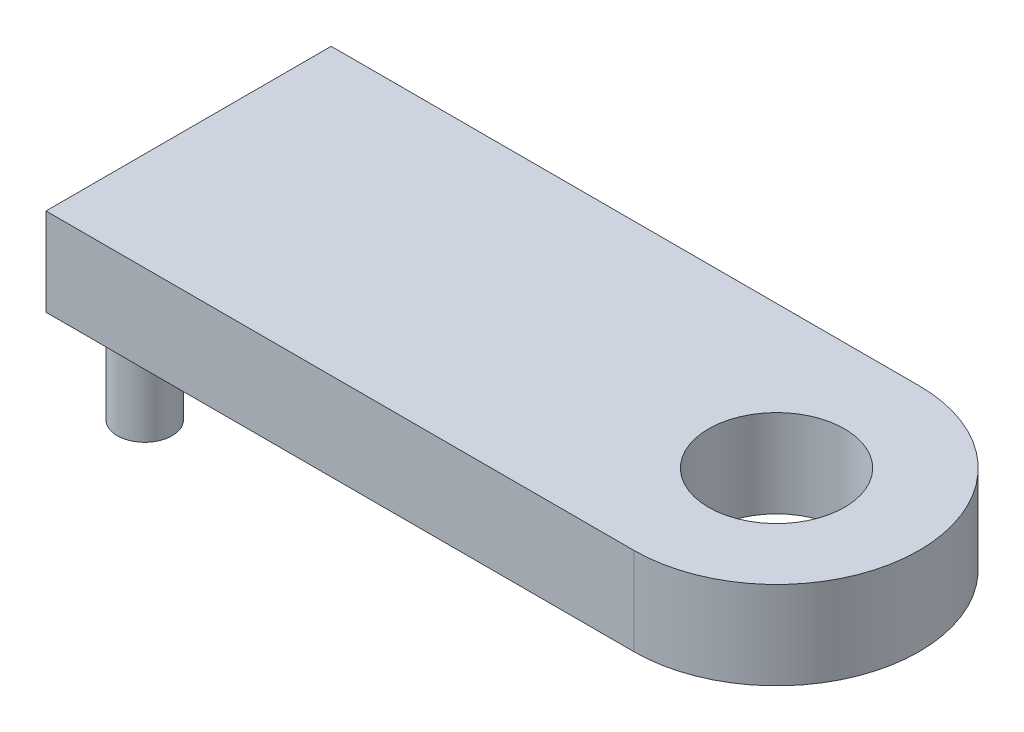
ISO-10303-21;
HEADER;
FILE_DESCRIPTION(('STEP AP214'),'2;1');
FILE_NAME('part.step','',(''),(''),'','','');
FILE_SCHEMA(('AUTOMOTIVE_DESIGN { 1 0 10303 214 1 1 1 1 }'));
ENDSEC;
DATA;
#1=APPLICATION_CONTEXT('core data for automotive mechanical design processes');
#2=APPLICATION_PROTOCOL_DEFINITION('international standard','automotive_design',2000,#1);
#3=PRODUCT_CONTEXT('',#1,'mechanical');
#4=PRODUCT('Part','Part','',(#3));
#5=PRODUCT_RELATED_PRODUCT_CATEGORY('part','',(#4));
#6=PRODUCT_DEFINITION_FORMATION('','',#4);
#7=PRODUCT_DEFINITION_CONTEXT('part definition',#1,'design');
#8=PRODUCT_DEFINITION('design','',#6,#7);
#9=PRODUCT_DEFINITION_SHAPE('','',#8);
#10=(LENGTH_UNIT() NAMED_UNIT(*) SI_UNIT(.MILLI.,.METRE.));
#11=(NAMED_UNIT(*) PLANE_ANGLE_UNIT() SI_UNIT($,.RADIAN.));
#12=(NAMED_UNIT(*) SI_UNIT($,.STERADIAN.) SOLID_ANGLE_UNIT());
#13=UNCERTAINTY_MEASURE_WITH_UNIT(LENGTH_MEASURE(1.E-05),#10,'distance_accuracy_value','');
#14=(GEOMETRIC_REPRESENTATION_CONTEXT(3) GLOBAL_UNCERTAINTY_ASSIGNED_CONTEXT((#13)) GLOBAL_UNIT_ASSIGNED_CONTEXT((#10,
#11,#12)) REPRESENTATION_CONTEXT('',''));
#15=CARTESIAN_POINT('',(0.,0.,0.));
#16=DIRECTION('',(0.,0.,1.));
#17=DIRECTION('',(1.,0.,0.));
#18=AXIS2_PLACEMENT_3D('',#15,#16,#17);
#19=CARTESIAN_POINT('',(5.5,27.1,0.));
#20=DIRECTION('',(0.,-1.,0.));
#21=DIRECTION('',(0.,0.,-1.));
#22=AXIS2_PLACEMENT_3D('',#19,#20,#21);
#23=CYLINDRICAL_SURFACE('',#22,6.5);
#24=CARTESIAN_POINT('',(5.5,23.1,0.));
#25=DIRECTION('',(0.,1.,0.));
#26=DIRECTION('',(0.,0.,1.));
#27=AXIS2_PLACEMENT_3D('',#24,#25,#26);
#28=CIRCLE('',#27,6.5);
#29=CARTESIAN_POINT('',(5.5,23.1,6.5));
#30=VERTEX_POINT('',#29);
#31=CARTESIAN_POINT('',(5.5,23.1,-6.5));
#32=VERTEX_POINT('',#31);
#33=EDGE_CURVE('E104',#30,#32,#28,.T.);
#34=ORIENTED_EDGE('',*,*,#33,.T.);
#35=DIRECTION('',(0.,-1.,0.));
#36=VECTOR('',#35,1.);
#37=CARTESIAN_POINT('',(5.5,27.1,-6.5));
#38=LINE('',#37,#36);
#39=CARTESIAN_POINT('',(5.5,27.1,-6.5));
#40=VERTEX_POINT('',#39);
#41=EDGE_CURVE('E95',#40,#32,#38,.T.);
#42=ORIENTED_EDGE('',*,*,#41,.F.);
#43=CARTESIAN_POINT('',(5.5,27.1,0.));
#44=DIRECTION('',(0.,1.,0.));
#45=DIRECTION('',(0.,0.,1.));
#46=AXIS2_PLACEMENT_3D('',#43,#44,#45);
#47=CIRCLE('',#46,6.5);
#48=CARTESIAN_POINT('',(5.5,27.1,6.5));
#49=VERTEX_POINT('',#48);
#50=EDGE_CURVE('E89',#49,#40,#47,.T.);
#51=ORIENTED_EDGE('',*,*,#50,.F.);
#52=DIRECTION('',(0.,-1.,0.));
#53=VECTOR('',#52,1.);
#54=CARTESIAN_POINT('',(5.5,27.1,6.5));
#55=LINE('',#54,#53);
#56=EDGE_CURVE('E100',#49,#30,#55,.T.);
#57=ORIENTED_EDGE('',*,*,#56,.T.);
#58=EDGE_LOOP('',(#34,#42,#51,#57));
#59=FACE_BOUND('',#58,.T.);
#60=ADVANCED_FACE('F37',(#59),#23,.T.);
#61=CARTESIAN_POINT('',(5.5,27.1,-6.5));
#62=DIRECTION('',(0.,0.,1.));
#63=DIRECTION('',(1.,0.,0.));
#64=AXIS2_PLACEMENT_3D('',#61,#62,#63);
#65=PLANE('',#64);
#66=DIRECTION('',(-1.,0.,0.));
#67=VECTOR('',#66,1.);
#68=CARTESIAN_POINT('',(5.5,23.1,-6.5));
#69=LINE('',#68,#67);
#70=CARTESIAN_POINT('',(-21.3,23.1,-6.5));
#71=VERTEX_POINT('',#70);
#72=EDGE_CURVE('E94',#32,#71,#69,.T.);
#73=ORIENTED_EDGE('',*,*,#72,.T.);
#74=DIRECTION('',(0.,-1.,0.));
#75=VECTOR('',#74,1.);
#76=CARTESIAN_POINT('',(-21.3,27.1,-6.5));
#77=LINE('',#76,#75);
#78=CARTESIAN_POINT('',(-21.3,27.1,-6.5));
#79=VERTEX_POINT('',#78);
#80=EDGE_CURVE('E92',#79,#71,#77,.T.);
#81=ORIENTED_EDGE('',*,*,#80,.F.);
#82=DIRECTION('',(-1.,0.,0.));
#83=VECTOR('',#82,1.);
#84=CARTESIAN_POINT('',(5.5,27.1,-6.5));
#85=LINE('',#84,#83);
#86=EDGE_CURVE('E84',#40,#79,#85,.T.);
#87=ORIENTED_EDGE('',*,*,#86,.F.);
#88=ORIENTED_EDGE('',*,*,#41,.T.);
#89=EDGE_LOOP('',(#73,#81,#87,#88));
#90=FACE_BOUND('',#89,.T.);
#91=ADVANCED_FACE('F93',(#90),#65,.F.);
#92=CARTESIAN_POINT('',(-21.3,27.1,-6.5));
#93=DIRECTION('',(1.,0.,0.));
#94=DIRECTION('',(0.,0.,-1.));
#95=AXIS2_PLACEMENT_3D('',#92,#93,#94);
#96=PLANE('',#95);
#97=DIRECTION('',(0.,0.,1.));
#98=VECTOR('',#97,1.);
#99=CARTESIAN_POINT('',(-21.3,23.1,-6.5));
#100=LINE('',#99,#98);
#101=CARTESIAN_POINT('',(-21.3,23.1,6.5));
#102=VERTEX_POINT('',#101);
#103=EDGE_CURVE('E70',#71,#102,#100,.T.);
#104=ORIENTED_EDGE('',*,*,#103,.T.);
#105=DIRECTION('',(0.,-1.,0.));
#106=VECTOR('',#105,1.);
#107=CARTESIAN_POINT('',(-21.3,27.1,6.5));
#108=LINE('',#107,#106);
#109=CARTESIAN_POINT('',(-21.3,27.1,6.5));
#110=VERTEX_POINT('',#109);
#111=EDGE_CURVE('E96',#110,#102,#108,.T.);
#112=ORIENTED_EDGE('',*,*,#111,.F.);
#113=DIRECTION('',(0.,0.,1.));
#114=VECTOR('',#113,1.);
#115=CARTESIAN_POINT('',(-21.3,27.1,-6.5));
#116=LINE('',#115,#114);
#117=EDGE_CURVE('E87',#79,#110,#116,.T.);
#118=ORIENTED_EDGE('',*,*,#117,.F.);
#119=ORIENTED_EDGE('',*,*,#80,.T.);
#120=EDGE_LOOP('',(#104,#112,#118,#119));
#121=FACE_BOUND('',#120,.T.);
#122=ADVANCED_FACE('F98',(#121),#96,.F.);
#123=CARTESIAN_POINT('',(-21.3,27.1,6.5));
#124=DIRECTION('',(0.,0.,-1.));
#125=DIRECTION('',(-1.,0.,0.));
#126=AXIS2_PLACEMENT_3D('',#123,#124,#125);
#127=PLANE('',#126);
#128=DIRECTION('',(1.,0.,0.));
#129=VECTOR('',#128,1.);
#130=CARTESIAN_POINT('',(-21.3,23.1,6.5));
#131=LINE('',#130,#129);
#132=EDGE_CURVE('E76',#102,#30,#131,.T.);
#133=ORIENTED_EDGE('',*,*,#132,.T.);
#134=ORIENTED_EDGE('',*,*,#56,.F.);
#135=DIRECTION('',(1.,0.,0.));
#136=VECTOR('',#135,1.);
#137=CARTESIAN_POINT('',(-21.3,27.1,6.5));
#138=LINE('',#137,#136);
#139=EDGE_CURVE('E53',#110,#49,#138,.T.);
#140=ORIENTED_EDGE('',*,*,#139,.F.);
#141=ORIENTED_EDGE('',*,*,#111,.T.);
#142=EDGE_LOOP('',(#133,#134,#140,#141));
#143=FACE_BOUND('',#142,.T.);
#144=ADVANCED_FACE('F131',(#143),#127,.F.);
#145=CARTESIAN_POINT('',(5.5,27.1,0.));
#146=DIRECTION('',(0.,1.,0.));
#147=DIRECTION('',(0.,0.,1.));
#148=AXIS2_PLACEMENT_3D('',#145,#146,#147);
#149=PLANE('',#148);
#150=CARTESIAN_POINT('',(5.5,27.1,0.));
#151=DIRECTION('',(0.,1.,0.));
#152=DIRECTION('',(0.,0.,1.));
#153=AXIS2_PLACEMENT_3D('',#150,#151,#152);
#154=CIRCLE('',#153,3.1);
#155=CARTESIAN_POINT('',(5.5,27.1,3.1));
#156=VERTEX_POINT('',#155);
#157=EDGE_CURVE('E107',#156,#156,#154,.T.);
#158=ORIENTED_EDGE('',*,*,#157,.F.);
#159=EDGE_LOOP('',(#158));
#160=FACE_BOUND('',#159,.T.);
#161=ORIENTED_EDGE('',*,*,#50,.T.);
#162=ORIENTED_EDGE('',*,*,#86,.T.);
#163=ORIENTED_EDGE('',*,*,#117,.T.);
#164=ORIENTED_EDGE('',*,*,#139,.T.);
#165=EDGE_LOOP('',(#161,#162,#163,#164));
#166=FACE_BOUND('',#165,.T.);
#167=ADVANCED_FACE('F85',(#160,#166),#149,.T.);
#168=CARTESIAN_POINT('',(5.5,23.1,0.));
#169=DIRECTION('',(0.,1.,0.));
#170=DIRECTION('',(0.,0.,1.));
#171=AXIS2_PLACEMENT_3D('',#168,#169,#170);
#172=PLANE('',#171);
#173=CARTESIAN_POINT('',(-18.8,23.1,-4.5));
#174=DIRECTION('',(0.,1.,0.));
#175=DIRECTION('',(0.,0.,1.));
#176=AXIS2_PLACEMENT_3D('',#173,#174,#175);
#177=CIRCLE('',#176,1.25);
#178=CARTESIAN_POINT('',(-18.8,23.1,-3.25));
#179=VERTEX_POINT('',#178);
#180=EDGE_CURVE('E11',#179,#179,#177,.F.);
#181=ORIENTED_EDGE('',*,*,#180,.F.);
#182=EDGE_LOOP('',(#181));
#183=FACE_BOUND('',#182,.T.);
#184=CARTESIAN_POINT('',(-18.8,23.1,4.5));
#185=DIRECTION('',(0.,1.,0.));
#186=DIRECTION('',(0.,0.,1.));
#187=AXIS2_PLACEMENT_3D('',#184,#185,#186);
#188=CIRCLE('',#187,1.25);
#189=CARTESIAN_POINT('',(-18.8,23.1,5.75));
#190=VERTEX_POINT('',#189);
#191=EDGE_CURVE('E45',#190,#190,#188,.F.);
#192=ORIENTED_EDGE('',*,*,#191,.F.);
#193=EDGE_LOOP('',(#192));
#194=FACE_BOUND('',#193,.T.);
#195=CARTESIAN_POINT('',(5.5,23.1,0.));
#196=DIRECTION('',(0.,1.,0.));
#197=DIRECTION('',(0.,0.,1.));
#198=AXIS2_PLACEMENT_3D('',#195,#196,#197);
#199=CIRCLE('',#198,3.1);
#200=CARTESIAN_POINT('',(5.5,23.1,3.1));
#201=VERTEX_POINT('',#200);
#202=EDGE_CURVE('E128',#201,#201,#199,.T.);
#203=ORIENTED_EDGE('',*,*,#202,.T.);
#204=EDGE_LOOP('',(#203));
#205=FACE_BOUND('',#204,.T.);
#206=ORIENTED_EDGE('',*,*,#33,.F.);
#207=ORIENTED_EDGE('',*,*,#132,.F.);
#208=ORIENTED_EDGE('',*,*,#103,.F.);
#209=ORIENTED_EDGE('',*,*,#72,.F.);
#210=EDGE_LOOP('',(#206,#207,#208,#209));
#211=FACE_BOUND('',#210,.T.);
#212=ADVANCED_FACE('F119',(#183,#194,#205,#211),#172,.F.);
#213=CARTESIAN_POINT('',(5.5,27.1,0.));
#214=DIRECTION('',(0.,-1.,0.));
#215=DIRECTION('',(0.,0.,-1.));
#216=AXIS2_PLACEMENT_3D('',#213,#214,#215);
#217=CYLINDRICAL_SURFACE('',#216,3.1);
#218=ORIENTED_EDGE('',*,*,#157,.T.);
#219=EDGE_LOOP('',(#218));
#220=FACE_BOUND('',#219,.T.);
#221=ORIENTED_EDGE('',*,*,#202,.F.);
#222=EDGE_LOOP('',(#221));
#223=FACE_BOUND('',#222,.T.);
#224=ADVANCED_FACE('F122',(#220,#223),#217,.F.);
#225=CARTESIAN_POINT('',(-18.8,23.1,4.5));
#226=DIRECTION('',(0.,-1.,0.));
#227=DIRECTION('',(0.,0.,-1.));
#228=AXIS2_PLACEMENT_3D('',#225,#226,#227);
#229=CYLINDRICAL_SURFACE('',#228,1.25);
#230=ORIENTED_EDGE('',*,*,#191,.T.);
#231=EDGE_LOOP('',(#230));
#232=FACE_BOUND('',#231,.T.);
#233=CARTESIAN_POINT('',(-18.8,19.1,4.5));
#234=DIRECTION('',(0.,1.,0.));
#235=DIRECTION('',(0.,0.,1.));
#236=AXIS2_PLACEMENT_3D('',#233,#234,#235);
#237=CIRCLE('',#236,1.25);
#238=CARTESIAN_POINT('',(-18.8,19.1,5.75));
#239=VERTEX_POINT('',#238);
#240=EDGE_CURVE('E222',#239,#239,#237,.T.);
#241=ORIENTED_EDGE('',*,*,#240,.T.);
#242=EDGE_LOOP('',(#241));
#243=FACE_BOUND('',#242,.T.);
#244=ADVANCED_FACE('F116',(#232,#243),#229,.T.);
#245=CARTESIAN_POINT('',(-18.8,19.1,4.5));
#246=DIRECTION('',(0.,1.,0.));
#247=DIRECTION('',(0.,0.,1.));
#248=AXIS2_PLACEMENT_3D('',#245,#246,#247);
#249=PLANE('',#248);
#250=ORIENTED_EDGE('',*,*,#240,.F.);
#251=EDGE_LOOP('',(#250));
#252=FACE_BOUND('',#251,.T.);
#253=ADVANCED_FACE('F185',(#252),#249,.F.);
#254=CARTESIAN_POINT('',(-18.8,23.1,-4.5));
#255=DIRECTION('',(0.,-1.,0.));
#256=DIRECTION('',(0.,0.,-1.));
#257=AXIS2_PLACEMENT_3D('',#254,#255,#256);
#258=CYLINDRICAL_SURFACE('',#257,1.25);
#259=ORIENTED_EDGE('',*,*,#180,.T.);
#260=EDGE_LOOP('',(#259));
#261=FACE_BOUND('',#260,.T.);
#262=CARTESIAN_POINT('',(-18.8,19.1,-4.5));
#263=DIRECTION('',(0.,1.,0.));
#264=DIRECTION('',(0.,0.,1.));
#265=AXIS2_PLACEMENT_3D('',#262,#263,#264);
#266=CIRCLE('',#265,1.25);
#267=CARTESIAN_POINT('',(-18.8,19.1,-3.25));
#268=VERTEX_POINT('',#267);
#269=EDGE_CURVE('E220',#268,#268,#266,.T.);
#270=ORIENTED_EDGE('',*,*,#269,.T.);
#271=EDGE_LOOP('',(#270));
#272=FACE_BOUND('',#271,.T.);
#273=ADVANCED_FACE('F194',(#261,#272),#258,.T.);
#274=CARTESIAN_POINT('',(-18.8,19.1,-4.5));
#275=DIRECTION('',(0.,1.,0.));
#276=DIRECTION('',(0.,0.,1.));
#277=AXIS2_PLACEMENT_3D('',#274,#275,#276);
#278=PLANE('',#277);
#279=ORIENTED_EDGE('',*,*,#269,.F.);
#280=EDGE_LOOP('',(#279));
#281=FACE_BOUND('',#280,.T.);
#282=ADVANCED_FACE('F204',(#281),#278,.F.);
#283=CLOSED_SHELL('',(#60,#91,#122,#144,#167,#212,#224,#244,#253,#273,#282));
#284=MANIFOLD_SOLID_BREP('B2',#283);
#285=ADVANCED_BREP_SHAPE_REPRESENTATION('',(#18,#284),#14);
#286=SHAPE_DEFINITION_REPRESENTATION(#9,#285);
ENDSEC;
END-ISO-10303-21;
